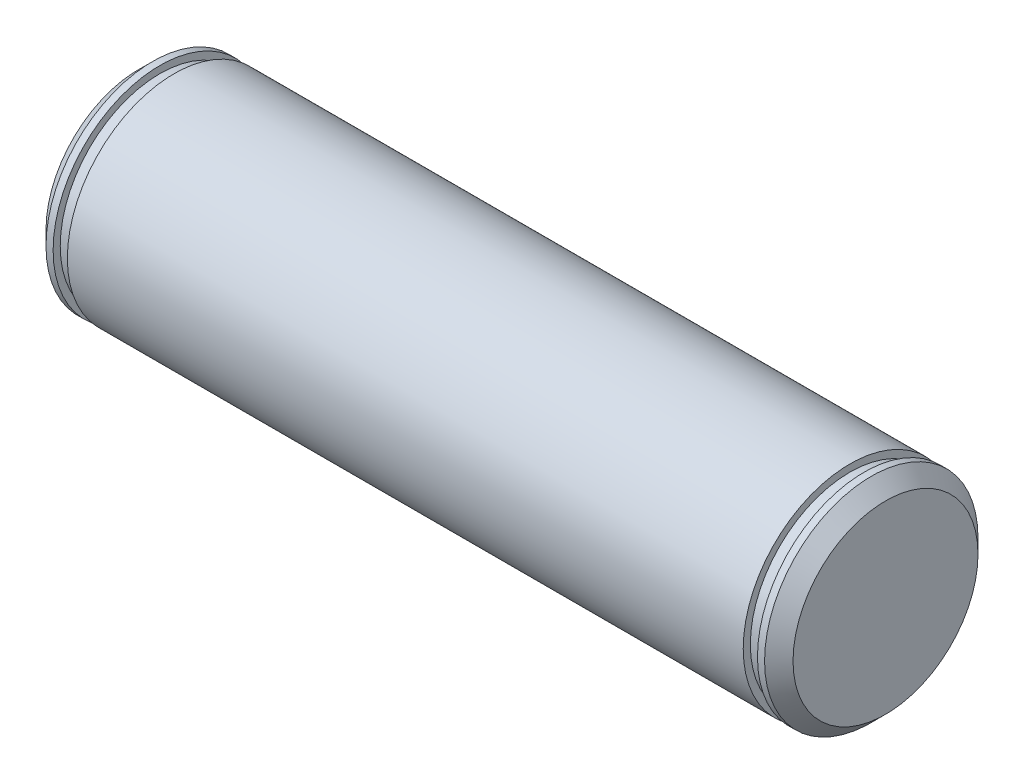
ISO-10303-21;
HEADER;
FILE_DESCRIPTION(('STEP AP214'),'2;1');
FILE_NAME('part.step','',(''),(''),'','','');
FILE_SCHEMA(('AUTOMOTIVE_DESIGN { 1 0 10303 214 1 1 1 1 }'));
ENDSEC;
DATA;
#1=APPLICATION_CONTEXT('core data for automotive mechanical design processes');
#2=APPLICATION_PROTOCOL_DEFINITION('international standard','automotive_design',2000,#1);
#3=PRODUCT_CONTEXT('',#1,'mechanical');
#4=PRODUCT('Part','Part','',(#3));
#5=PRODUCT_RELATED_PRODUCT_CATEGORY('part','',(#4));
#6=PRODUCT_DEFINITION_FORMATION('','',#4);
#7=PRODUCT_DEFINITION_CONTEXT('part definition',#1,'design');
#8=PRODUCT_DEFINITION('design','',#6,#7);
#9=PRODUCT_DEFINITION_SHAPE('','',#8);
#10=(LENGTH_UNIT() NAMED_UNIT(*) SI_UNIT(.MILLI.,.METRE.));
#11=(NAMED_UNIT(*) PLANE_ANGLE_UNIT() SI_UNIT($,.RADIAN.));
#12=(NAMED_UNIT(*) SI_UNIT($,.STERADIAN.) SOLID_ANGLE_UNIT());
#13=UNCERTAINTY_MEASURE_WITH_UNIT(LENGTH_MEASURE(1.E-05),#10,'distance_accuracy_value','');
#14=(GEOMETRIC_REPRESENTATION_CONTEXT(3) GLOBAL_UNCERTAINTY_ASSIGNED_CONTEXT((#13)) GLOBAL_UNIT_ASSIGNED_CONTEXT((#10,
#11,#12)) REPRESENTATION_CONTEXT('',''));
#15=CARTESIAN_POINT('',(0.,0.,0.));
#16=DIRECTION('',(0.,0.,1.));
#17=DIRECTION('',(1.,0.,0.));
#18=AXIS2_PLACEMENT_3D('',#15,#16,#17);
#19=CARTESIAN_POINT('',(52.5,0.,0.));
#20=DIRECTION('',(-1.,0.,0.));
#21=DIRECTION('',(0.,0.,1.));
#22=AXIS2_PLACEMENT_3D('',#19,#20,#21);
#23=PLANE('',#22);
#24=CARTESIAN_POINT('',(52.5,0.,0.));
#25=DIRECTION('',(-1.,0.,0.));
#26=DIRECTION('',(0.,0.,1.));
#27=AXIS2_PLACEMENT_3D('',#24,#25,#26);
#28=CIRCLE('',#27,13.);
#29=CARTESIAN_POINT('',(52.5,0.,13.));
#30=VERTEX_POINT('',#29);
#31=EDGE_CURVE('E10',#30,#30,#28,.T.);
#32=ORIENTED_EDGE('',*,*,#31,.F.);
#33=EDGE_LOOP('',(#32));
#34=FACE_BOUND('',#33,.T.);
#35=ADVANCED_FACE('F39',(#34),#23,.F.);
#36=CARTESIAN_POINT('',(52.5,0.,0.));
#37=DIRECTION('',(-1.,0.,0.));
#38=DIRECTION('',(0.,0.,1.));
#39=AXIS2_PLACEMENT_3D('',#36,#37,#38);
#40=CONICAL_SURFACE('',#39,13.,0.785398163397451);
#41=CARTESIAN_POINT('',(50.5,0.,0.));
#42=DIRECTION('',(-1.,0.,0.));
#43=DIRECTION('',(0.,0.,1.));
#44=AXIS2_PLACEMENT_3D('',#41,#42,#43);
#45=CIRCLE('',#44,15.);
#46=CARTESIAN_POINT('',(50.5,0.,15.));
#47=VERTEX_POINT('',#46);
#48=EDGE_CURVE('E45',#47,#47,#45,.T.);
#49=ORIENTED_EDGE('',*,*,#48,.F.);
#50=EDGE_LOOP('',(#49));
#51=FACE_BOUND('',#50,.T.);
#52=ORIENTED_EDGE('',*,*,#31,.T.);
#53=EDGE_LOOP('',(#52));
#54=FACE_BOUND('',#53,.T.);
#55=ADVANCED_FACE('F141',(#51,#54),#40,.T.);
#56=CARTESIAN_POINT('',(-52.5,0.,0.));
#57=DIRECTION('',(-1.,0.,0.));
#58=DIRECTION('',(0.,0.,1.));
#59=AXIS2_PLACEMENT_3D('',#56,#57,#58);
#60=CYLINDRICAL_SURFACE('',#59,15.);
#61=CARTESIAN_POINT('',(49.5,0.,0.));
#62=DIRECTION('',(-1.,0.,0.));
#63=DIRECTION('',(0.,0.,1.));
#64=AXIS2_PLACEMENT_3D('',#61,#62,#63);
#65=CIRCLE('',#64,15.);
#66=CARTESIAN_POINT('',(49.5,0.,15.));
#67=VERTEX_POINT('',#66);
#68=EDGE_CURVE('E49',#67,#67,#65,.T.);
#69=ORIENTED_EDGE('',*,*,#68,.F.);
#70=EDGE_LOOP('',(#69));
#71=FACE_BOUND('',#70,.T.);
#72=ORIENTED_EDGE('',*,*,#48,.T.);
#73=EDGE_LOOP('',(#72));
#74=FACE_BOUND('',#73,.T.);
#75=ADVANCED_FACE('F136',(#71,#74),#60,.T.);
#76=CARTESIAN_POINT('',(49.5,15.,0.));
#77=DIRECTION('',(1.,0.,0.));
#78=DIRECTION('',(0.,0.,-1.));
#79=AXIS2_PLACEMENT_3D('',#76,#77,#78);
#80=PLANE('',#79);
#81=CARTESIAN_POINT('',(49.5,0.,0.));
#82=DIRECTION('',(-1.,0.,0.));
#83=DIRECTION('',(0.,0.,1.));
#84=AXIS2_PLACEMENT_3D('',#81,#82,#83);
#85=CIRCLE('',#84,14.);
#86=CARTESIAN_POINT('',(49.5,0.,14.));
#87=VERTEX_POINT('',#86);
#88=EDGE_CURVE('E53',#87,#87,#85,.T.);
#89=ORIENTED_EDGE('',*,*,#88,.F.);
#90=EDGE_LOOP('',(#89));
#91=FACE_BOUND('',#90,.T.);
#92=ORIENTED_EDGE('',*,*,#68,.T.);
#93=EDGE_LOOP('',(#92));
#94=FACE_BOUND('',#93,.T.);
#95=ADVANCED_FACE('F130',(#91,#94),#80,.F.);
#96=CARTESIAN_POINT('',(-52.5,0.,0.));
#97=DIRECTION('',(-1.,0.,0.));
#98=DIRECTION('',(0.,0.,1.));
#99=AXIS2_PLACEMENT_3D('',#96,#97,#98);
#100=CYLINDRICAL_SURFACE('',#99,14.);
#101=CARTESIAN_POINT('',(47.5,0.,0.));
#102=DIRECTION('',(-1.,0.,0.));
#103=DIRECTION('',(0.,0.,1.));
#104=AXIS2_PLACEMENT_3D('',#101,#102,#103);
#105=CIRCLE('',#104,14.);
#106=CARTESIAN_POINT('',(47.5,0.,14.));
#107=VERTEX_POINT('',#106);
#108=EDGE_CURVE('E58',#107,#107,#105,.T.);
#109=ORIENTED_EDGE('',*,*,#108,.F.);
#110=EDGE_LOOP('',(#109));
#111=FACE_BOUND('',#110,.T.);
#112=ORIENTED_EDGE('',*,*,#88,.T.);
#113=EDGE_LOOP('',(#112));
#114=FACE_BOUND('',#113,.T.);
#115=ADVANCED_FACE('F124',(#111,#114),#100,.T.);
#116=CARTESIAN_POINT('',(47.5,14.,0.));
#117=DIRECTION('',(-1.,0.,0.));
#118=DIRECTION('',(0.,0.,1.));
#119=AXIS2_PLACEMENT_3D('',#116,#117,#118);
#120=PLANE('',#119);
#121=CARTESIAN_POINT('',(47.5,0.,0.));
#122=DIRECTION('',(-1.,0.,0.));
#123=DIRECTION('',(0.,0.,1.));
#124=AXIS2_PLACEMENT_3D('',#121,#122,#123);
#125=CIRCLE('',#124,15.);
#126=CARTESIAN_POINT('',(47.5,0.,15.));
#127=VERTEX_POINT('',#126);
#128=EDGE_CURVE('E61',#127,#127,#125,.T.);
#129=ORIENTED_EDGE('',*,*,#128,.F.);
#130=EDGE_LOOP('',(#129));
#131=FACE_BOUND('',#130,.T.);
#132=ORIENTED_EDGE('',*,*,#108,.T.);
#133=EDGE_LOOP('',(#132));
#134=FACE_BOUND('',#133,.T.);
#135=ADVANCED_FACE('F118',(#131,#134),#120,.F.);
#136=CARTESIAN_POINT('',(-52.5,0.,0.));
#137=DIRECTION('',(-1.,0.,0.));
#138=DIRECTION('',(0.,0.,1.));
#139=AXIS2_PLACEMENT_3D('',#136,#137,#138);
#140=CYLINDRICAL_SURFACE('',#139,15.);
#141=CARTESIAN_POINT('',(-47.5,0.,0.));
#142=DIRECTION('',(-1.,0.,0.));
#143=DIRECTION('',(0.,0.,1.));
#144=AXIS2_PLACEMENT_3D('',#141,#142,#143);
#145=CIRCLE('',#144,15.);
#146=CARTESIAN_POINT('',(-47.5,0.,15.));
#147=VERTEX_POINT('',#146);
#148=EDGE_CURVE('E64',#147,#147,#145,.T.);
#149=ORIENTED_EDGE('',*,*,#148,.F.);
#150=EDGE_LOOP('',(#149));
#151=FACE_BOUND('',#150,.T.);
#152=ORIENTED_EDGE('',*,*,#128,.T.);
#153=EDGE_LOOP('',(#152));
#154=FACE_BOUND('',#153,.T.);
#155=ADVANCED_FACE('F112',(#151,#154),#140,.T.);
#156=CARTESIAN_POINT('',(-47.5,14.,0.));
#157=DIRECTION('',(1.,0.,0.));
#158=DIRECTION('',(0.,0.,-1.));
#159=AXIS2_PLACEMENT_3D('',#156,#157,#158);
#160=PLANE('',#159);
#161=CARTESIAN_POINT('',(-47.5,0.,0.));
#162=DIRECTION('',(-1.,0.,0.));
#163=DIRECTION('',(0.,0.,1.));
#164=AXIS2_PLACEMENT_3D('',#161,#162,#163);
#165=CIRCLE('',#164,14.);
#166=CARTESIAN_POINT('',(-47.5,0.,14.));
#167=VERTEX_POINT('',#166);
#168=EDGE_CURVE('E67',#167,#167,#165,.T.);
#169=ORIENTED_EDGE('',*,*,#168,.F.);
#170=EDGE_LOOP('',(#169));
#171=FACE_BOUND('',#170,.T.);
#172=ORIENTED_EDGE('',*,*,#148,.T.);
#173=EDGE_LOOP('',(#172));
#174=FACE_BOUND('',#173,.T.);
#175=ADVANCED_FACE('F106',(#171,#174),#160,.F.);
#176=CARTESIAN_POINT('',(-52.5,0.,0.));
#177=DIRECTION('',(-1.,0.,0.));
#178=DIRECTION('',(0.,0.,1.));
#179=AXIS2_PLACEMENT_3D('',#176,#177,#178);
#180=CYLINDRICAL_SURFACE('',#179,14.);
#181=CARTESIAN_POINT('',(-49.5,0.,0.));
#182=DIRECTION('',(-1.,0.,0.));
#183=DIRECTION('',(0.,0.,1.));
#184=AXIS2_PLACEMENT_3D('',#181,#182,#183);
#185=CIRCLE('',#184,14.);
#186=CARTESIAN_POINT('',(-49.5,0.,14.));
#187=VERTEX_POINT('',#186);
#188=EDGE_CURVE('E70',#187,#187,#185,.T.);
#189=ORIENTED_EDGE('',*,*,#188,.F.);
#190=EDGE_LOOP('',(#189));
#191=FACE_BOUND('',#190,.T.);
#192=ORIENTED_EDGE('',*,*,#168,.T.);
#193=EDGE_LOOP('',(#192));
#194=FACE_BOUND('',#193,.T.);
#195=ADVANCED_FACE('F100',(#191,#194),#180,.T.);
#196=CARTESIAN_POINT('',(-49.5,15.,0.));
#197=DIRECTION('',(-1.,0.,0.));
#198=DIRECTION('',(0.,0.,1.));
#199=AXIS2_PLACEMENT_3D('',#196,#197,#198);
#200=PLANE('',#199);
#201=CARTESIAN_POINT('',(-49.5,0.,0.));
#202=DIRECTION('',(-1.,0.,0.));
#203=DIRECTION('',(0.,0.,1.));
#204=AXIS2_PLACEMENT_3D('',#201,#202,#203);
#205=CIRCLE('',#204,15.);
#206=CARTESIAN_POINT('',(-49.5,0.,15.));
#207=VERTEX_POINT('',#206);
#208=EDGE_CURVE('E73',#207,#207,#205,.T.);
#209=ORIENTED_EDGE('',*,*,#208,.F.);
#210=EDGE_LOOP('',(#209));
#211=FACE_BOUND('',#210,.T.);
#212=ORIENTED_EDGE('',*,*,#188,.T.);
#213=EDGE_LOOP('',(#212));
#214=FACE_BOUND('',#213,.T.);
#215=ADVANCED_FACE('F94',(#211,#214),#200,.F.);
#216=CARTESIAN_POINT('',(-52.5,0.,0.));
#217=DIRECTION('',(-1.,0.,0.));
#218=DIRECTION('',(0.,0.,1.));
#219=AXIS2_PLACEMENT_3D('',#216,#217,#218);
#220=CYLINDRICAL_SURFACE('',#219,15.);
#221=CARTESIAN_POINT('',(-50.5,0.,0.));
#222=DIRECTION('',(-1.,0.,0.));
#223=DIRECTION('',(0.,0.,1.));
#224=AXIS2_PLACEMENT_3D('',#221,#222,#223);
#225=CIRCLE('',#224,15.);
#226=CARTESIAN_POINT('',(-50.5,0.,15.));
#227=VERTEX_POINT('',#226);
#228=EDGE_CURVE('E76',#227,#227,#225,.T.);
#229=ORIENTED_EDGE('',*,*,#228,.F.);
#230=EDGE_LOOP('',(#229));
#231=FACE_BOUND('',#230,.T.);
#232=ORIENTED_EDGE('',*,*,#208,.T.);
#233=EDGE_LOOP('',(#232));
#234=FACE_BOUND('',#233,.T.);
#235=ADVANCED_FACE('F88',(#231,#234),#220,.T.);
#236=CARTESIAN_POINT('',(-50.5,0.,0.));
#237=DIRECTION('',(1.,0.,0.));
#238=DIRECTION('',(0.,0.,-1.));
#239=AXIS2_PLACEMENT_3D('',#236,#237,#238);
#240=CONICAL_SURFACE('',#239,15.,0.78539816339745);
#241=CARTESIAN_POINT('',(-52.5,0.,0.));
#242=DIRECTION('',(-1.,0.,0.));
#243=DIRECTION('',(0.,0.,1.));
#244=AXIS2_PLACEMENT_3D('',#241,#242,#243);
#245=CIRCLE('',#244,13.);
#246=CARTESIAN_POINT('',(-52.5,0.,13.));
#247=VERTEX_POINT('',#246);
#248=EDGE_CURVE('E79',#247,#247,#245,.T.);
#249=ORIENTED_EDGE('',*,*,#248,.F.);
#250=EDGE_LOOP('',(#249));
#251=FACE_BOUND('',#250,.T.);
#252=ORIENTED_EDGE('',*,*,#228,.T.);
#253=EDGE_LOOP('',(#252));
#254=FACE_BOUND('',#253,.T.);
#255=ADVANCED_FACE('F85',(#251,#254),#240,.T.);
#256=CARTESIAN_POINT('',(-52.5,0.,0.));
#257=DIRECTION('',(1.,0.,0.));
#258=DIRECTION('',(0.,0.,-1.));
#259=AXIS2_PLACEMENT_3D('',#256,#257,#258);
#260=PLANE('',#259);
#261=ORIENTED_EDGE('',*,*,#248,.T.);
#262=EDGE_LOOP('',(#261));
#263=FACE_BOUND('',#262,.T.);
#264=ADVANCED_FACE('F83',(#263),#260,.F.);
#265=CLOSED_SHELL('',(#35,#55,#75,#95,#115,#135,#155,#175,#195,#215,#235,#255,#264));
#266=MANIFOLD_SOLID_BREP('B2',#265);
#267=ADVANCED_BREP_SHAPE_REPRESENTATION('',(#18,#266),#14);
#268=SHAPE_DEFINITION_REPRESENTATION(#9,#267);
ENDSEC;
END-ISO-10303-21;
